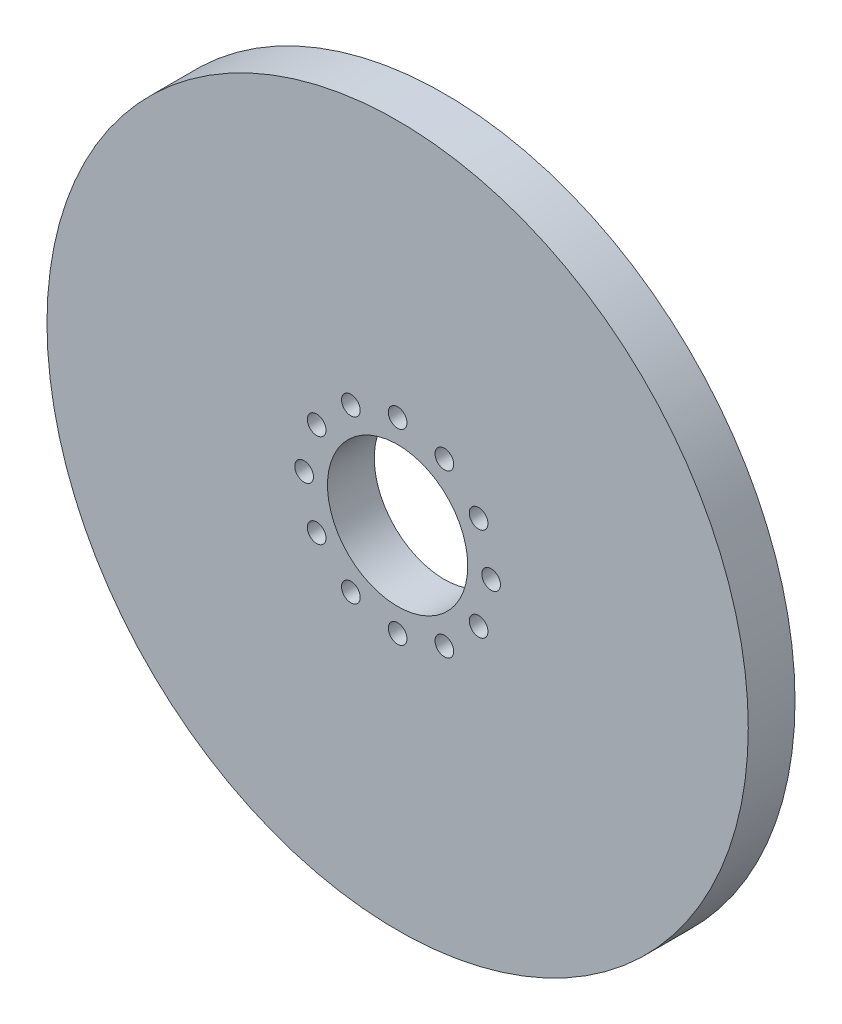
ISO-10303-21;
HEADER;
FILE_DESCRIPTION(('STEP AP214'),'2;1');
FILE_NAME('part.step','',(''),(''),'','','');
FILE_SCHEMA(('AUTOMOTIVE_DESIGN { 1 0 10303 214 1 1 1 1 }'));
ENDSEC;
DATA;
#1=APPLICATION_CONTEXT('core data for automotive mechanical design processes');
#2=APPLICATION_PROTOCOL_DEFINITION('international standard','automotive_design',2000,#1);
#3=PRODUCT_CONTEXT('',#1,'mechanical');
#4=PRODUCT('Part','Part','',(#3));
#5=PRODUCT_RELATED_PRODUCT_CATEGORY('part','',(#4));
#6=PRODUCT_DEFINITION_FORMATION('','',#4);
#7=PRODUCT_DEFINITION_CONTEXT('part definition',#1,'design');
#8=PRODUCT_DEFINITION('design','',#6,#7);
#9=PRODUCT_DEFINITION_SHAPE('','',#8);
#10=(LENGTH_UNIT() NAMED_UNIT(*) SI_UNIT(.MILLI.,.METRE.));
#11=(NAMED_UNIT(*) PLANE_ANGLE_UNIT() SI_UNIT($,.RADIAN.));
#12=(NAMED_UNIT(*) SI_UNIT($,.STERADIAN.) SOLID_ANGLE_UNIT());
#13=UNCERTAINTY_MEASURE_WITH_UNIT(LENGTH_MEASURE(1.E-05),#10,'distance_accuracy_value','');
#14=(GEOMETRIC_REPRESENTATION_CONTEXT(3) GLOBAL_UNCERTAINTY_ASSIGNED_CONTEXT((#13)) GLOBAL_UNIT_ASSIGNED_CONTEXT((#10,
#11,#12)) REPRESENTATION_CONTEXT('',''));
#15=CARTESIAN_POINT('',(0.,0.,0.));
#16=DIRECTION('',(0.,0.,1.));
#17=DIRECTION('',(1.,0.,0.));
#18=AXIS2_PLACEMENT_3D('',#15,#16,#17);
#19=CARTESIAN_POINT('',(0.,0.,20.));
#20=DIRECTION('',(0.,0.,1.));
#21=DIRECTION('',(1.,0.,0.));
#22=AXIS2_PLACEMENT_3D('',#19,#20,#21);
#23=PLANE('',#22);
#24=CARTESIAN_POINT('',(-34.6410161513773,20.0000000000004,20.));
#25=DIRECTION('',(0.,0.,1.));
#26=DIRECTION('',(1.,0.,0.));
#27=AXIS2_PLACEMENT_3D('',#24,#25,#26);
#28=CIRCLE('',#27,4.00000000000001);
#29=CARTESIAN_POINT('',(-30.6410161513773,20.0000000000004,20.));
#30=VERTEX_POINT('',#29);
#31=EDGE_CURVE('E106',#30,#30,#28,.T.);
#32=ORIENTED_EDGE('',*,*,#31,.F.);
#33=EDGE_LOOP('',(#32));
#34=FACE_BOUND('',#33,.T.);
#35=CARTESIAN_POINT('',(-34.6410161513777,-19.9999999999997,20.));
#36=DIRECTION('',(0.,0.,1.));
#37=DIRECTION('',(1.,0.,0.));
#38=AXIS2_PLACEMENT_3D('',#35,#36,#37);
#39=CIRCLE('',#38,4.);
#40=CARTESIAN_POINT('',(-30.6410161513777,-19.9999999999997,20.));
#41=VERTEX_POINT('',#40);
#42=EDGE_CURVE('E94',#41,#41,#39,.T.);
#43=ORIENTED_EDGE('',*,*,#42,.F.);
#44=EDGE_LOOP('',(#43));
#45=FACE_BOUND('',#44,.T.);
#46=CARTESIAN_POINT('',(0.,-40.,20.));
#47=DIRECTION('',(0.,0.,1.));
#48=DIRECTION('',(1.,0.,0.));
#49=AXIS2_PLACEMENT_3D('',#46,#47,#48);
#50=CIRCLE('',#49,4.00000000000027);
#51=CARTESIAN_POINT('',(4.00000000000028,-40.,20.));
#52=VERTEX_POINT('',#51);
#53=EDGE_CURVE('E82',#52,#52,#50,.T.);
#54=ORIENTED_EDGE('',*,*,#53,.F.);
#55=EDGE_LOOP('',(#54));
#56=FACE_BOUND('',#55,.T.);
#57=CARTESIAN_POINT('',(34.6410161513775,-20.0000000000002,20.));
#58=DIRECTION('',(0.,0.,1.));
#59=DIRECTION('',(1.,0.,0.));
#60=AXIS2_PLACEMENT_3D('',#57,#58,#59);
#61=CIRCLE('',#60,4.00000000000001);
#62=CARTESIAN_POINT('',(38.6410161513775,-20.0000000000002,20.));
#63=VERTEX_POINT('',#62);
#64=EDGE_CURVE('E70',#63,#63,#61,.T.);
#65=ORIENTED_EDGE('',*,*,#64,.F.);
#66=EDGE_LOOP('',(#65));
#67=FACE_BOUND('',#66,.T.);
#68=CARTESIAN_POINT('',(34.6410161513776,19.9999999999999,20.));
#69=DIRECTION('',(0.,0.,1.));
#70=DIRECTION('',(1.,0.,0.));
#71=AXIS2_PLACEMENT_3D('',#68,#69,#70);
#72=CIRCLE('',#71,4.);
#73=CARTESIAN_POINT('',(38.6410161513776,19.9999999999999,20.));
#74=VERTEX_POINT('',#73);
#75=EDGE_CURVE('E58',#74,#74,#72,.T.);
#76=ORIENTED_EDGE('',*,*,#75,.F.);
#77=EDGE_LOOP('',(#76));
#78=FACE_BOUND('',#77,.T.);
#79=CARTESIAN_POINT('',(0.,40.,20.));
#80=DIRECTION('',(0.,0.,1.));
#81=DIRECTION('',(1.,0.,0.));
#82=AXIS2_PLACEMENT_3D('',#79,#80,#81);
#83=CIRCLE('',#82,4.);
#84=CARTESIAN_POINT('',(4.,40.,20.));
#85=VERTEX_POINT('',#84);
#86=EDGE_CURVE('E46',#85,#85,#83,.T.);
#87=ORIENTED_EDGE('',*,*,#86,.F.);
#88=EDGE_LOOP('',(#87));
#89=FACE_BOUND('',#88,.T.);
#90=CARTESIAN_POINT('',(0.,0.,20.));
#91=DIRECTION('',(0.,0.,1.));
#92=DIRECTION('',(1.,0.,0.));
#93=AXIS2_PLACEMENT_3D('',#90,#91,#92);
#94=CIRCLE('',#93,150.);
#95=CARTESIAN_POINT('',(150.,0.,20.));
#96=VERTEX_POINT('',#95);
#97=EDGE_CURVE('E10',#96,#96,#94,.T.);
#98=ORIENTED_EDGE('',*,*,#97,.T.);
#99=EDGE_LOOP('',(#98));
#100=FACE_BOUND('',#99,.T.);
#101=CARTESIAN_POINT('',(0.,0.,20.));
#102=DIRECTION('',(0.,0.,1.));
#103=DIRECTION('',(1.,0.,0.));
#104=AXIS2_PLACEMENT_3D('',#101,#102,#103);
#105=CIRCLE('',#104,30.);
#106=CARTESIAN_POINT('',(30.,0.,20.));
#107=VERTEX_POINT('',#106);
#108=EDGE_CURVE('E41',#107,#107,#105,.T.);
#109=ORIENTED_EDGE('',*,*,#108,.F.);
#110=EDGE_LOOP('',(#109));
#111=FACE_BOUND('',#110,.T.);
#112=CARTESIAN_POINT('',(20.,34.6410161513775,20.));
#113=DIRECTION('',(0.,0.,1.));
#114=DIRECTION('',(1.,0.,0.));
#115=AXIS2_PLACEMENT_3D('',#112,#113,#114);
#116=CIRCLE('',#115,4.);
#117=CARTESIAN_POINT('',(24.,34.6410161513775,20.));
#118=VERTEX_POINT('',#117);
#119=EDGE_CURVE('E52',#118,#118,#116,.T.);
#120=ORIENTED_EDGE('',*,*,#119,.F.);
#121=EDGE_LOOP('',(#120));
#122=FACE_BOUND('',#121,.T.);
#123=CARTESIAN_POINT('',(40.,-1.39659253553725E-13,20.));
#124=DIRECTION('',(0.,0.,1.));
#125=DIRECTION('',(1.,0.,0.));
#126=AXIS2_PLACEMENT_3D('',#123,#124,#125);
#127=CIRCLE('',#126,4.);
#128=CARTESIAN_POINT('',(44.,-1.39659253553725E-13,20.));
#129=VERTEX_POINT('',#128);
#130=EDGE_CURVE('E64',#129,#129,#127,.T.);
#131=ORIENTED_EDGE('',*,*,#130,.F.);
#132=EDGE_LOOP('',(#131));
#133=FACE_BOUND('',#132,.T.);
#134=CARTESIAN_POINT('',(20.0000000000032,-34.6410161513767,20.));
#135=DIRECTION('',(0.,0.,1.));
#136=DIRECTION('',(1.,0.,0.));
#137=AXIS2_PLACEMENT_3D('',#134,#135,#136);
#138=CIRCLE('',#137,4.00000000000302);
#139=CARTESIAN_POINT('',(24.0000000000062,-34.6410161513767,20.));
#140=VERTEX_POINT('',#139);
#141=EDGE_CURVE('E76',#140,#140,#138,.T.);
#142=ORIENTED_EDGE('',*,*,#141,.F.);
#143=EDGE_LOOP('',(#142));
#144=FACE_BOUND('',#143,.T.);
#145=CARTESIAN_POINT('',(-19.9999999999968,-34.6410161513784,20.));
#146=DIRECTION('',(0.,0.,1.));
#147=DIRECTION('',(1.,0.,0.));
#148=AXIS2_PLACEMENT_3D('',#145,#146,#147);
#149=CIRCLE('',#148,4.0000000000036);
#150=CARTESIAN_POINT('',(-15.9999999999932,-34.6410161513784,20.));
#151=VERTEX_POINT('',#150);
#152=EDGE_CURVE('E88',#151,#151,#149,.T.);
#153=ORIENTED_EDGE('',*,*,#152,.F.);
#154=EDGE_LOOP('',(#153));
#155=FACE_BOUND('',#154,.T.);
#156=CARTESIAN_POINT('',(-40.,4.18977760661176E-13,20.));
#157=DIRECTION('',(0.,0.,1.));
#158=DIRECTION('',(1.,0.,0.));
#159=AXIS2_PLACEMENT_3D('',#156,#157,#158);
#160=CIRCLE('',#159,4.);
#161=CARTESIAN_POINT('',(-36.,4.18977760661176E-13,20.));
#162=VERTEX_POINT('',#161);
#163=EDGE_CURVE('E100',#162,#162,#160,.T.);
#164=ORIENTED_EDGE('',*,*,#163,.F.);
#165=EDGE_LOOP('',(#164));
#166=FACE_BOUND('',#165,.T.);
#167=CARTESIAN_POINT('',(-19.9999999999996,34.6410161513778,20.));
#168=DIRECTION('',(0.,0.,1.));
#169=DIRECTION('',(1.,0.,0.));
#170=AXIS2_PLACEMENT_3D('',#167,#168,#169);
#171=CIRCLE('',#170,4.);
#172=CARTESIAN_POINT('',(-15.9999999999996,34.6410161513778,20.));
#173=VERTEX_POINT('',#172);
#174=EDGE_CURVE('E112',#173,#173,#171,.T.);
#175=ORIENTED_EDGE('',*,*,#174,.F.);
#176=EDGE_LOOP('',(#175));
#177=FACE_BOUND('',#176,.T.);
#178=ADVANCED_FACE('F30',(#34,#45,#56,#67,#78,#89,#100,#111,#122,#133,#144,#155,#166,#177),#23,.T.);
#179=CARTESIAN_POINT('',(0.,0.,0.));
#180=DIRECTION('',(0.,0.,1.));
#181=DIRECTION('',(1.,0.,0.));
#182=AXIS2_PLACEMENT_3D('',#179,#180,#181);
#183=PLANE('',#182);
#184=CARTESIAN_POINT('',(-34.6410161513773,20.0000000000004,0.));
#185=DIRECTION('',(0.,0.,1.));
#186=DIRECTION('',(1.,0.,0.));
#187=AXIS2_PLACEMENT_3D('',#184,#185,#186);
#188=CIRCLE('',#187,4.00000000000001);
#189=CARTESIAN_POINT('',(-30.6410161513773,20.0000000000004,0.));
#190=VERTEX_POINT('',#189);
#191=EDGE_CURVE('E109',#190,#190,#188,.T.);
#192=ORIENTED_EDGE('',*,*,#191,.T.);
#193=EDGE_LOOP('',(#192));
#194=FACE_BOUND('',#193,.T.);
#195=CARTESIAN_POINT('',(-34.6410161513777,-19.9999999999997,0.));
#196=DIRECTION('',(0.,0.,1.));
#197=DIRECTION('',(1.,0.,0.));
#198=AXIS2_PLACEMENT_3D('',#195,#196,#197);
#199=CIRCLE('',#198,4.);
#200=CARTESIAN_POINT('',(-30.6410161513777,-19.9999999999997,0.));
#201=VERTEX_POINT('',#200);
#202=EDGE_CURVE('E97',#201,#201,#199,.T.);
#203=ORIENTED_EDGE('',*,*,#202,.T.);
#204=EDGE_LOOP('',(#203));
#205=FACE_BOUND('',#204,.T.);
#206=CARTESIAN_POINT('',(0.,-40.,0.));
#207=DIRECTION('',(0.,0.,1.));
#208=DIRECTION('',(1.,0.,0.));
#209=AXIS2_PLACEMENT_3D('',#206,#207,#208);
#210=CIRCLE('',#209,4.00000000000027);
#211=CARTESIAN_POINT('',(4.00000000000028,-40.,0.));
#212=VERTEX_POINT('',#211);
#213=EDGE_CURVE('E85',#212,#212,#210,.T.);
#214=ORIENTED_EDGE('',*,*,#213,.T.);
#215=EDGE_LOOP('',(#214));
#216=FACE_BOUND('',#215,.T.);
#217=CARTESIAN_POINT('',(34.6410161513775,-20.0000000000002,0.));
#218=DIRECTION('',(0.,0.,1.));
#219=DIRECTION('',(1.,0.,0.));
#220=AXIS2_PLACEMENT_3D('',#217,#218,#219);
#221=CIRCLE('',#220,4.00000000000001);
#222=CARTESIAN_POINT('',(38.6410161513775,-20.0000000000002,0.));
#223=VERTEX_POINT('',#222);
#224=EDGE_CURVE('E73',#223,#223,#221,.T.);
#225=ORIENTED_EDGE('',*,*,#224,.T.);
#226=EDGE_LOOP('',(#225));
#227=FACE_BOUND('',#226,.T.);
#228=CARTESIAN_POINT('',(34.6410161513776,19.9999999999999,0.));
#229=DIRECTION('',(0.,0.,1.));
#230=DIRECTION('',(1.,0.,0.));
#231=AXIS2_PLACEMENT_3D('',#228,#229,#230);
#232=CIRCLE('',#231,4.);
#233=CARTESIAN_POINT('',(38.6410161513776,19.9999999999999,0.));
#234=VERTEX_POINT('',#233);
#235=EDGE_CURVE('E61',#234,#234,#232,.T.);
#236=ORIENTED_EDGE('',*,*,#235,.T.);
#237=EDGE_LOOP('',(#236));
#238=FACE_BOUND('',#237,.T.);
#239=CARTESIAN_POINT('',(0.,40.,0.));
#240=DIRECTION('',(0.,0.,1.));
#241=DIRECTION('',(1.,0.,0.));
#242=AXIS2_PLACEMENT_3D('',#239,#240,#241);
#243=CIRCLE('',#242,4.);
#244=CARTESIAN_POINT('',(4.,40.,0.));
#245=VERTEX_POINT('',#244);
#246=EDGE_CURVE('E49',#245,#245,#243,.T.);
#247=ORIENTED_EDGE('',*,*,#246,.T.);
#248=EDGE_LOOP('',(#247));
#249=FACE_BOUND('',#248,.T.);
#250=CARTESIAN_POINT('',(0.,0.,0.));
#251=DIRECTION('',(0.,0.,1.));
#252=DIRECTION('',(1.,0.,0.));
#253=AXIS2_PLACEMENT_3D('',#250,#251,#252);
#254=CIRCLE('',#253,150.);
#255=CARTESIAN_POINT('',(150.,0.,0.));
#256=VERTEX_POINT('',#255);
#257=EDGE_CURVE('E34',#256,#256,#254,.T.);
#258=ORIENTED_EDGE('',*,*,#257,.F.);
#259=EDGE_LOOP('',(#258));
#260=FACE_BOUND('',#259,.T.);
#261=CARTESIAN_POINT('',(0.,0.,0.));
#262=DIRECTION('',(0.,0.,1.));
#263=DIRECTION('',(1.,0.,0.));
#264=AXIS2_PLACEMENT_3D('',#261,#262,#263);
#265=CIRCLE('',#264,30.);
#266=CARTESIAN_POINT('',(30.,0.,0.));
#267=VERTEX_POINT('',#266);
#268=EDGE_CURVE('E43',#267,#267,#265,.T.);
#269=ORIENTED_EDGE('',*,*,#268,.T.);
#270=EDGE_LOOP('',(#269));
#271=FACE_BOUND('',#270,.T.);
#272=CARTESIAN_POINT('',(20.,34.6410161513775,0.));
#273=DIRECTION('',(0.,0.,1.));
#274=DIRECTION('',(1.,0.,0.));
#275=AXIS2_PLACEMENT_3D('',#272,#273,#274);
#276=CIRCLE('',#275,4.);
#277=CARTESIAN_POINT('',(24.,34.6410161513775,0.));
#278=VERTEX_POINT('',#277);
#279=EDGE_CURVE('E55',#278,#278,#276,.T.);
#280=ORIENTED_EDGE('',*,*,#279,.T.);
#281=EDGE_LOOP('',(#280));
#282=FACE_BOUND('',#281,.T.);
#283=CARTESIAN_POINT('',(40.,-1.39659253553725E-13,0.));
#284=DIRECTION('',(0.,0.,1.));
#285=DIRECTION('',(1.,0.,0.));
#286=AXIS2_PLACEMENT_3D('',#283,#284,#285);
#287=CIRCLE('',#286,4.);
#288=CARTESIAN_POINT('',(44.,-1.39659253553725E-13,0.));
#289=VERTEX_POINT('',#288);
#290=EDGE_CURVE('E67',#289,#289,#287,.T.);
#291=ORIENTED_EDGE('',*,*,#290,.T.);
#292=EDGE_LOOP('',(#291));
#293=FACE_BOUND('',#292,.T.);
#294=CARTESIAN_POINT('',(20.0000000000032,-34.6410161513767,0.));
#295=DIRECTION('',(0.,0.,1.));
#296=DIRECTION('',(1.,0.,0.));
#297=AXIS2_PLACEMENT_3D('',#294,#295,#296);
#298=CIRCLE('',#297,4.00000000000302);
#299=CARTESIAN_POINT('',(24.0000000000062,-34.6410161513767,0.));
#300=VERTEX_POINT('',#299);
#301=EDGE_CURVE('E79',#300,#300,#298,.T.);
#302=ORIENTED_EDGE('',*,*,#301,.T.);
#303=EDGE_LOOP('',(#302));
#304=FACE_BOUND('',#303,.T.);
#305=CARTESIAN_POINT('',(-19.9999999999968,-34.6410161513784,0.));
#306=DIRECTION('',(0.,0.,1.));
#307=DIRECTION('',(1.,0.,0.));
#308=AXIS2_PLACEMENT_3D('',#305,#306,#307);
#309=CIRCLE('',#308,4.0000000000036);
#310=CARTESIAN_POINT('',(-15.9999999999932,-34.6410161513784,0.));
#311=VERTEX_POINT('',#310);
#312=EDGE_CURVE('E91',#311,#311,#309,.T.);
#313=ORIENTED_EDGE('',*,*,#312,.T.);
#314=EDGE_LOOP('',(#313));
#315=FACE_BOUND('',#314,.T.);
#316=CARTESIAN_POINT('',(-40.,4.18977760661176E-13,0.));
#317=DIRECTION('',(0.,0.,1.));
#318=DIRECTION('',(1.,0.,0.));
#319=AXIS2_PLACEMENT_3D('',#316,#317,#318);
#320=CIRCLE('',#319,4.);
#321=CARTESIAN_POINT('',(-36.,4.18977760661176E-13,0.));
#322=VERTEX_POINT('',#321);
#323=EDGE_CURVE('E103',#322,#322,#320,.T.);
#324=ORIENTED_EDGE('',*,*,#323,.T.);
#325=EDGE_LOOP('',(#324));
#326=FACE_BOUND('',#325,.T.);
#327=CARTESIAN_POINT('',(-19.9999999999996,34.6410161513778,0.));
#328=DIRECTION('',(0.,0.,1.));
#329=DIRECTION('',(1.,0.,0.));
#330=AXIS2_PLACEMENT_3D('',#327,#328,#329);
#331=CIRCLE('',#330,4.);
#332=CARTESIAN_POINT('',(-15.9999999999996,34.6410161513778,0.));
#333=VERTEX_POINT('',#332);
#334=EDGE_CURVE('E115',#333,#333,#331,.T.);
#335=ORIENTED_EDGE('',*,*,#334,.T.);
#336=EDGE_LOOP('',(#335));
#337=FACE_BOUND('',#336,.T.);
#338=ADVANCED_FACE('F125',(#194,#205,#216,#227,#238,#249,#260,#271,#282,#293,#304,#315,#326,
#337),#183,.F.);
#339=CARTESIAN_POINT('',(0.,0.,20.));
#340=DIRECTION('',(0.,0.,-1.));
#341=DIRECTION('',(-1.,0.,0.));
#342=AXIS2_PLACEMENT_3D('',#339,#340,#341);
#343=CYLINDRICAL_SURFACE('',#342,150.);
#344=ORIENTED_EDGE('',*,*,#97,.F.);
#345=EDGE_LOOP('',(#344));
#346=FACE_BOUND('',#345,.T.);
#347=ORIENTED_EDGE('',*,*,#257,.T.);
#348=EDGE_LOOP('',(#347));
#349=FACE_BOUND('',#348,.T.);
#350=ADVANCED_FACE('F32',(#346,#349),#343,.T.);
#351=CARTESIAN_POINT('',(0.,0.,20.));
#352=DIRECTION('',(0.,0.,-1.));
#353=DIRECTION('',(-1.,0.,0.));
#354=AXIS2_PLACEMENT_3D('',#351,#352,#353);
#355=CYLINDRICAL_SURFACE('',#354,30.);
#356=ORIENTED_EDGE('',*,*,#108,.T.);
#357=EDGE_LOOP('',(#356));
#358=FACE_BOUND('',#357,.T.);
#359=ORIENTED_EDGE('',*,*,#268,.F.);
#360=EDGE_LOOP('',(#359));
#361=FACE_BOUND('',#360,.T.);
#362=ADVANCED_FACE('F135',(#358,#361),#355,.F.);
#363=CARTESIAN_POINT('',(0.,40.,20.));
#364=DIRECTION('',(0.,0.,-1.));
#365=DIRECTION('',(-1.,0.,0.));
#366=AXIS2_PLACEMENT_3D('',#363,#364,#365);
#367=CYLINDRICAL_SURFACE('',#366,4.);
#368=ORIENTED_EDGE('',*,*,#86,.T.);
#369=EDGE_LOOP('',(#368));
#370=FACE_BOUND('',#369,.T.);
#371=ORIENTED_EDGE('',*,*,#246,.F.);
#372=EDGE_LOOP('',(#371));
#373=FACE_BOUND('',#372,.T.);
#374=ADVANCED_FACE('F138',(#370,#373),#367,.F.);
#375=CARTESIAN_POINT('',(20.,34.6410161513775,20.));
#376=DIRECTION('',(0.,0.,-1.));
#377=DIRECTION('',(-1.,0.,0.));
#378=AXIS2_PLACEMENT_3D('',#375,#376,#377);
#379=CYLINDRICAL_SURFACE('',#378,4.);
#380=ORIENTED_EDGE('',*,*,#119,.T.);
#381=EDGE_LOOP('',(#380));
#382=FACE_BOUND('',#381,.T.);
#383=ORIENTED_EDGE('',*,*,#279,.F.);
#384=EDGE_LOOP('',(#383));
#385=FACE_BOUND('',#384,.T.);
#386=ADVANCED_FACE('F142',(#382,#385),#379,.F.);
#387=CARTESIAN_POINT('',(34.6410161513776,19.9999999999999,20.));
#388=DIRECTION('',(0.,0.,-1.));
#389=DIRECTION('',(-1.,0.,0.));
#390=AXIS2_PLACEMENT_3D('',#387,#388,#389);
#391=CYLINDRICAL_SURFACE('',#390,4.);
#392=ORIENTED_EDGE('',*,*,#75,.T.);
#393=EDGE_LOOP('',(#392));
#394=FACE_BOUND('',#393,.T.);
#395=ORIENTED_EDGE('',*,*,#235,.F.);
#396=EDGE_LOOP('',(#395));
#397=FACE_BOUND('',#396,.T.);
#398=ADVANCED_FACE('F146',(#394,#397),#391,.F.);
#399=CARTESIAN_POINT('',(40.,-1.39659253553725E-13,20.));
#400=DIRECTION('',(0.,0.,-1.));
#401=DIRECTION('',(-1.,0.,0.));
#402=AXIS2_PLACEMENT_3D('',#399,#400,#401);
#403=CYLINDRICAL_SURFACE('',#402,4.);
#404=ORIENTED_EDGE('',*,*,#130,.T.);
#405=EDGE_LOOP('',(#404));
#406=FACE_BOUND('',#405,.T.);
#407=ORIENTED_EDGE('',*,*,#290,.F.);
#408=EDGE_LOOP('',(#407));
#409=FACE_BOUND('',#408,.T.);
#410=ADVANCED_FACE('F150',(#406,#409),#403,.F.);
#411=CARTESIAN_POINT('',(34.6410161513775,-20.0000000000002,20.));
#412=DIRECTION('',(0.,0.,-1.));
#413=DIRECTION('',(-1.,0.,0.));
#414=AXIS2_PLACEMENT_3D('',#411,#412,#413);
#415=CYLINDRICAL_SURFACE('',#414,4.00000000000001);
#416=ORIENTED_EDGE('',*,*,#64,.T.);
#417=EDGE_LOOP('',(#416));
#418=FACE_BOUND('',#417,.T.);
#419=ORIENTED_EDGE('',*,*,#224,.F.);
#420=EDGE_LOOP('',(#419));
#421=FACE_BOUND('',#420,.T.);
#422=ADVANCED_FACE('F154',(#418,#421),#415,.F.);
#423=CARTESIAN_POINT('',(20.0000000000032,-34.6410161513767,20.));
#424=DIRECTION('',(0.,0.,-1.));
#425=DIRECTION('',(-1.,0.,0.));
#426=AXIS2_PLACEMENT_3D('',#423,#424,#425);
#427=CYLINDRICAL_SURFACE('',#426,4.00000000000302);
#428=ORIENTED_EDGE('',*,*,#141,.T.);
#429=EDGE_LOOP('',(#428));
#430=FACE_BOUND('',#429,.T.);
#431=ORIENTED_EDGE('',*,*,#301,.F.);
#432=EDGE_LOOP('',(#431));
#433=FACE_BOUND('',#432,.T.);
#434=ADVANCED_FACE('F158',(#430,#433),#427,.F.);
#435=CARTESIAN_POINT('',(0.,-40.,20.));
#436=DIRECTION('',(0.,0.,-1.));
#437=DIRECTION('',(-1.,0.,0.));
#438=AXIS2_PLACEMENT_3D('',#435,#436,#437);
#439=CYLINDRICAL_SURFACE('',#438,4.00000000000027);
#440=ORIENTED_EDGE('',*,*,#53,.T.);
#441=EDGE_LOOP('',(#440));
#442=FACE_BOUND('',#441,.T.);
#443=ORIENTED_EDGE('',*,*,#213,.F.);
#444=EDGE_LOOP('',(#443));
#445=FACE_BOUND('',#444,.T.);
#446=ADVANCED_FACE('F162',(#442,#445),#439,.F.);
#447=CARTESIAN_POINT('',(-19.9999999999968,-34.6410161513784,20.));
#448=DIRECTION('',(0.,0.,-1.));
#449=DIRECTION('',(-1.,0.,0.));
#450=AXIS2_PLACEMENT_3D('',#447,#448,#449);
#451=CYLINDRICAL_SURFACE('',#450,4.0000000000036);
#452=ORIENTED_EDGE('',*,*,#152,.T.);
#453=EDGE_LOOP('',(#452));
#454=FACE_BOUND('',#453,.T.);
#455=ORIENTED_EDGE('',*,*,#312,.F.);
#456=EDGE_LOOP('',(#455));
#457=FACE_BOUND('',#456,.T.);
#458=ADVANCED_FACE('F166',(#454,#457),#451,.F.);
#459=CARTESIAN_POINT('',(-34.6410161513777,-19.9999999999997,20.));
#460=DIRECTION('',(0.,0.,-1.));
#461=DIRECTION('',(-1.,0.,0.));
#462=AXIS2_PLACEMENT_3D('',#459,#460,#461);
#463=CYLINDRICAL_SURFACE('',#462,4.);
#464=ORIENTED_EDGE('',*,*,#42,.T.);
#465=EDGE_LOOP('',(#464));
#466=FACE_BOUND('',#465,.T.);
#467=ORIENTED_EDGE('',*,*,#202,.F.);
#468=EDGE_LOOP('',(#467));
#469=FACE_BOUND('',#468,.T.);
#470=ADVANCED_FACE('F170',(#466,#469),#463,.F.);
#471=CARTESIAN_POINT('',(-40.,4.18977760661176E-13,20.));
#472=DIRECTION('',(0.,0.,-1.));
#473=DIRECTION('',(-1.,0.,0.));
#474=AXIS2_PLACEMENT_3D('',#471,#472,#473);
#475=CYLINDRICAL_SURFACE('',#474,4.);
#476=ORIENTED_EDGE('',*,*,#163,.T.);
#477=EDGE_LOOP('',(#476));
#478=FACE_BOUND('',#477,.T.);
#479=ORIENTED_EDGE('',*,*,#323,.F.);
#480=EDGE_LOOP('',(#479));
#481=FACE_BOUND('',#480,.T.);
#482=ADVANCED_FACE('F174',(#478,#481),#475,.F.);
#483=CARTESIAN_POINT('',(-34.6410161513773,20.0000000000004,20.));
#484=DIRECTION('',(0.,0.,-1.));
#485=DIRECTION('',(-1.,0.,0.));
#486=AXIS2_PLACEMENT_3D('',#483,#484,#485);
#487=CYLINDRICAL_SURFACE('',#486,4.00000000000001);
#488=ORIENTED_EDGE('',*,*,#31,.T.);
#489=EDGE_LOOP('',(#488));
#490=FACE_BOUND('',#489,.T.);
#491=ORIENTED_EDGE('',*,*,#191,.F.);
#492=EDGE_LOOP('',(#491));
#493=FACE_BOUND('',#492,.T.);
#494=ADVANCED_FACE('F178',(#490,#493),#487,.F.);
#495=CARTESIAN_POINT('',(-19.9999999999996,34.6410161513778,20.));
#496=DIRECTION('',(0.,0.,-1.));
#497=DIRECTION('',(-1.,0.,0.));
#498=AXIS2_PLACEMENT_3D('',#495,#496,#497);
#499=CYLINDRICAL_SURFACE('',#498,4.);
#500=ORIENTED_EDGE('',*,*,#174,.T.);
#501=EDGE_LOOP('',(#500));
#502=FACE_BOUND('',#501,.T.);
#503=ORIENTED_EDGE('',*,*,#334,.F.);
#504=EDGE_LOOP('',(#503));
#505=FACE_BOUND('',#504,.T.);
#506=ADVANCED_FACE('F121',(#502,#505),#499,.F.);
#507=CLOSED_SHELL('',(#178,#338,#350,#362,#374,#386,#398,#410,#422,#434,#446,#458,#470,#482,
#494,#506));
#508=MANIFOLD_SOLID_BREP('B2',#507);
#509=ADVANCED_BREP_SHAPE_REPRESENTATION('',(#18,#508),#14);
#510=SHAPE_DEFINITION_REPRESENTATION(#9,#509);
ENDSEC;
END-ISO-10303-21;
